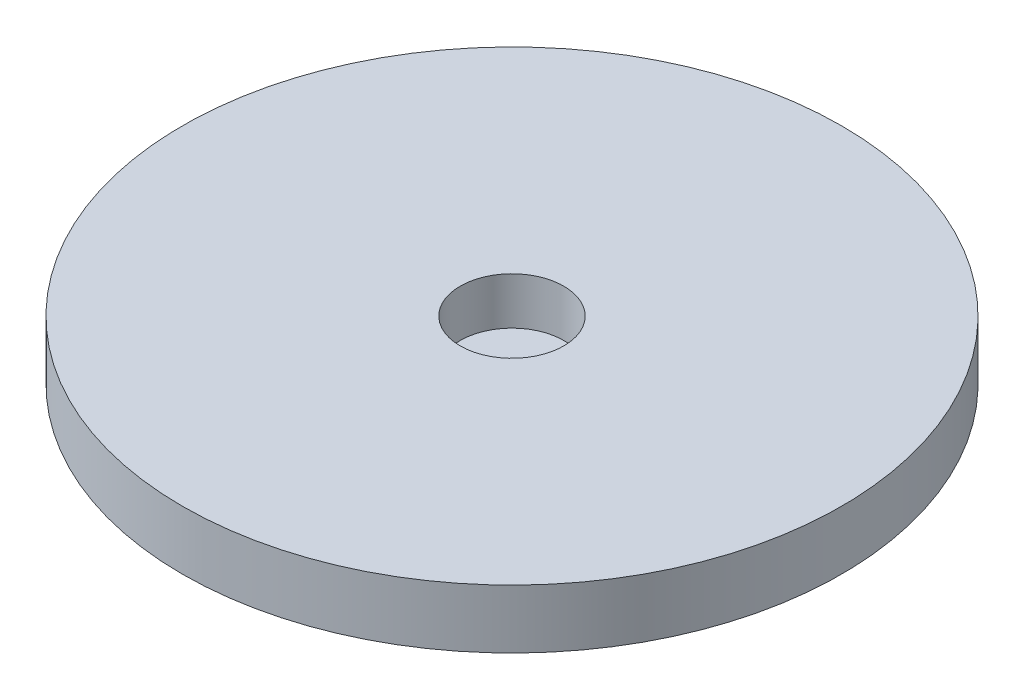
ISO-10303-21;
HEADER;
FILE_DESCRIPTION(('STEP AP214'),'2;1');
FILE_NAME('part.step','',(''),(''),'','','');
FILE_SCHEMA(('AUTOMOTIVE_DESIGN { 1 0 10303 214 1 1 1 1 }'));
ENDSEC;
DATA;
#1=APPLICATION_CONTEXT('core data for automotive mechanical design processes');
#2=APPLICATION_PROTOCOL_DEFINITION('international standard','automotive_design',2000,#1);
#3=PRODUCT_CONTEXT('',#1,'mechanical');
#4=PRODUCT('Part','Part','',(#3));
#5=PRODUCT_RELATED_PRODUCT_CATEGORY('part','',(#4));
#6=PRODUCT_DEFINITION_FORMATION('','',#4);
#7=PRODUCT_DEFINITION_CONTEXT('part definition',#1,'design');
#8=PRODUCT_DEFINITION('design','',#6,#7);
#9=PRODUCT_DEFINITION_SHAPE('','',#8);
#10=(LENGTH_UNIT() NAMED_UNIT(*) SI_UNIT(.MILLI.,.METRE.));
#11=(NAMED_UNIT(*) PLANE_ANGLE_UNIT() SI_UNIT($,.RADIAN.));
#12=(NAMED_UNIT(*) SI_UNIT($,.STERADIAN.) SOLID_ANGLE_UNIT());
#13=UNCERTAINTY_MEASURE_WITH_UNIT(LENGTH_MEASURE(1.E-05),#10,'distance_accuracy_value','');
#14=(GEOMETRIC_REPRESENTATION_CONTEXT(3) GLOBAL_UNCERTAINTY_ASSIGNED_CONTEXT((#13)) GLOBAL_UNIT_ASSIGNED_CONTEXT((#10,
#11,#12)) REPRESENTATION_CONTEXT('',''));
#15=CARTESIAN_POINT('',(0.,0.,0.));
#16=DIRECTION('',(0.,0.,1.));
#17=DIRECTION('',(1.,0.,0.));
#18=AXIS2_PLACEMENT_3D('',#15,#16,#17);
#19=CARTESIAN_POINT('',(0.,12.5,0.));
#20=DIRECTION('',(0.,-1.,0.));
#21=DIRECTION('',(0.,0.,-1.));
#22=AXIS2_PLACEMENT_3D('',#19,#20,#21);
#23=CYLINDRICAL_SURFACE('',#22,70.);
#24=CARTESIAN_POINT('',(0.,12.5,0.));
#25=DIRECTION('',(0.,1.,0.));
#26=DIRECTION('',(0.,0.,1.));
#27=AXIS2_PLACEMENT_3D('',#24,#25,#26);
#28=CIRCLE('',#27,70.);
#29=CARTESIAN_POINT('',(0.,12.5,70.));
#30=VERTEX_POINT('',#29);
#31=EDGE_CURVE('E10',#30,#30,#28,.T.);
#32=ORIENTED_EDGE('',*,*,#31,.F.);
#33=EDGE_LOOP('',(#32));
#34=FACE_BOUND('',#33,.T.);
#35=CARTESIAN_POINT('',(0.,0.,0.));
#36=DIRECTION('',(0.,1.,0.));
#37=DIRECTION('',(0.,0.,1.));
#38=AXIS2_PLACEMENT_3D('',#35,#36,#37);
#39=CIRCLE('',#38,70.);
#40=CARTESIAN_POINT('',(0.,0.,70.));
#41=VERTEX_POINT('',#40);
#42=EDGE_CURVE('E35',#41,#41,#39,.T.);
#43=ORIENTED_EDGE('',*,*,#42,.T.);
#44=EDGE_LOOP('',(#43));
#45=FACE_BOUND('',#44,.T.);
#46=ADVANCED_FACE('F32',(#34,#45),#23,.T.);
#47=CARTESIAN_POINT('',(0.,12.5,0.));
#48=DIRECTION('',(0.,1.,0.));
#49=DIRECTION('',(0.,0.,1.));
#50=AXIS2_PLACEMENT_3D('',#47,#48,#49);
#51=PLANE('',#50);
#52=CARTESIAN_POINT('',(0.,12.5,0.));
#53=DIRECTION('',(0.,1.,0.));
#54=DIRECTION('',(0.,0.,1.));
#55=AXIS2_PLACEMENT_3D('',#52,#53,#54);
#56=CIRCLE('',#55,11.);
#57=CARTESIAN_POINT('',(0.,12.5,11.));
#58=VERTEX_POINT('',#57);
#59=EDGE_CURVE('E44',#58,#58,#56,.T.);
#60=ORIENTED_EDGE('',*,*,#59,.F.);
#61=EDGE_LOOP('',(#60));
#62=FACE_BOUND('',#61,.T.);
#63=ORIENTED_EDGE('',*,*,#31,.T.);
#64=EDGE_LOOP('',(#63));
#65=FACE_BOUND('',#64,.T.);
#66=ADVANCED_FACE('F59',(#62,#65),#51,.T.);
#67=CARTESIAN_POINT('',(0.,0.,0.));
#68=DIRECTION('',(0.,1.,0.));
#69=DIRECTION('',(0.,0.,1.));
#70=AXIS2_PLACEMENT_3D('',#67,#68,#69);
#71=PLANE('',#70);
#72=ORIENTED_EDGE('',*,*,#42,.F.);
#73=EDGE_LOOP('',(#72));
#74=FACE_BOUND('',#73,.T.);
#75=ADVANCED_FACE('F55',(#74),#71,.F.);
#76=CARTESIAN_POINT('',(0.,2.5,0.));
#77=DIRECTION('',(0.,1.,0.));
#78=DIRECTION('',(0.,0.,1.));
#79=AXIS2_PLACEMENT_3D('',#76,#77,#78);
#80=CYLINDRICAL_SURFACE('',#79,11.);
#81=CARTESIAN_POINT('',(0.,2.5,0.));
#82=DIRECTION('',(0.,1.,0.));
#83=DIRECTION('',(0.,0.,1.));
#84=AXIS2_PLACEMENT_3D('',#81,#82,#83);
#85=CIRCLE('',#84,11.);
#86=CARTESIAN_POINT('',(0.,2.5,11.));
#87=VERTEX_POINT('',#86);
#88=EDGE_CURVE('E42',#87,#87,#85,.T.);
#89=ORIENTED_EDGE('',*,*,#88,.F.);
#90=EDGE_LOOP('',(#89));
#91=FACE_BOUND('',#90,.T.);
#92=ORIENTED_EDGE('',*,*,#59,.T.);
#93=EDGE_LOOP('',(#92));
#94=FACE_BOUND('',#93,.T.);
#95=ADVANCED_FACE('F52',(#91,#94),#80,.F.);
#96=CARTESIAN_POINT('',(0.,2.5,0.));
#97=DIRECTION('',(0.,1.,0.));
#98=DIRECTION('',(0.,0.,1.));
#99=AXIS2_PLACEMENT_3D('',#96,#97,#98);
#100=PLANE('',#99);
#101=ORIENTED_EDGE('',*,*,#88,.T.);
#102=EDGE_LOOP('',(#101));
#103=FACE_BOUND('',#102,.T.);
#104=ADVANCED_FACE('F50',(#103),#100,.T.);
#105=CLOSED_SHELL('',(#46,#66,#75,#95,#104));
#106=MANIFOLD_SOLID_BREP('B2',#105);
#107=ADVANCED_BREP_SHAPE_REPRESENTATION('',(#18,#106),#14);
#108=SHAPE_DEFINITION_REPRESENTATION(#9,#107);
ENDSEC;
END-ISO-10303-21;
